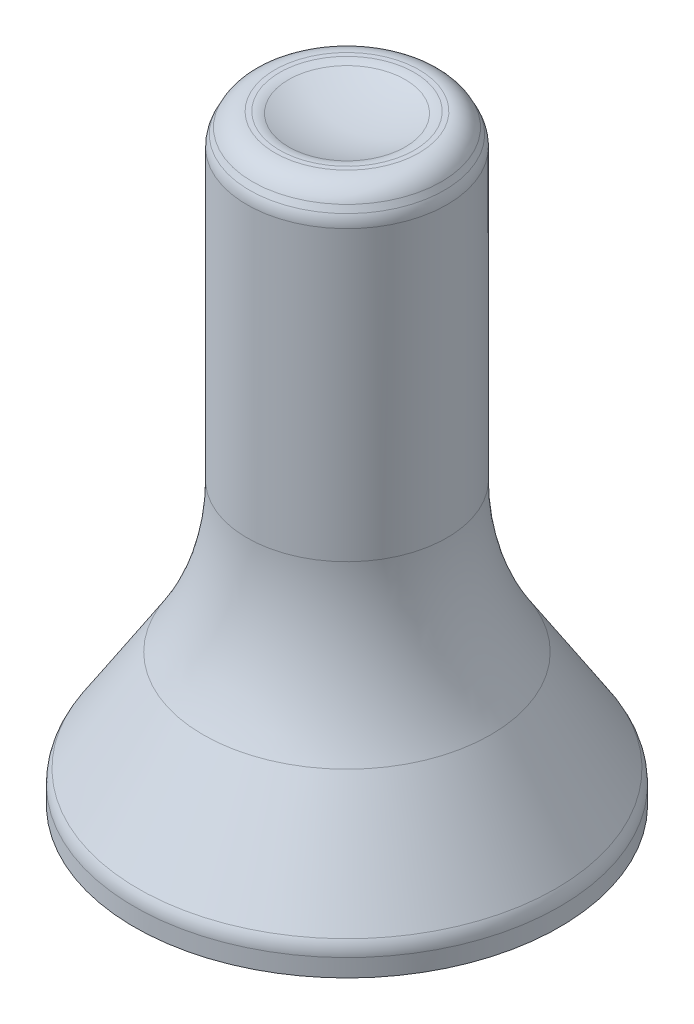
ISO-10303-21;
HEADER;
FILE_DESCRIPTION(('STEP AP214'),'2;1');
FILE_NAME('part.step','',(''),(''),'','','');
FILE_SCHEMA(('AUTOMOTIVE_DESIGN { 1 0 10303 214 1 1 1 1 }'));
ENDSEC;
DATA;
#1=APPLICATION_CONTEXT('core data for automotive mechanical design processes');
#2=APPLICATION_PROTOCOL_DEFINITION('international standard','automotive_design',2000,#1);
#3=PRODUCT_CONTEXT('',#1,'mechanical');
#4=PRODUCT('Part','Part','',(#3));
#5=PRODUCT_RELATED_PRODUCT_CATEGORY('part','',(#4));
#6=PRODUCT_DEFINITION_FORMATION('','',#4);
#7=PRODUCT_DEFINITION_CONTEXT('part definition',#1,'design');
#8=PRODUCT_DEFINITION('design','',#6,#7);
#9=PRODUCT_DEFINITION_SHAPE('','',#8);
#10=(LENGTH_UNIT() NAMED_UNIT(*) SI_UNIT(.MILLI.,.METRE.));
#11=(NAMED_UNIT(*) PLANE_ANGLE_UNIT() SI_UNIT($,.RADIAN.));
#12=(NAMED_UNIT(*) SI_UNIT($,.STERADIAN.) SOLID_ANGLE_UNIT());
#13=UNCERTAINTY_MEASURE_WITH_UNIT(LENGTH_MEASURE(1.E-05),#10,'distance_accuracy_value','');
#14=(GEOMETRIC_REPRESENTATION_CONTEXT(3) GLOBAL_UNCERTAINTY_ASSIGNED_CONTEXT((#13)) GLOBAL_UNIT_ASSIGNED_CONTEXT((#10,
#11,#12)) REPRESENTATION_CONTEXT('',''));
#15=CARTESIAN_POINT('',(0.,0.,0.));
#16=DIRECTION('',(0.,0.,1.));
#17=DIRECTION('',(1.,0.,0.));
#18=AXIS2_PLACEMENT_3D('',#15,#16,#17);
#19=CARTESIAN_POINT('',(0.,17.75,0.));
#20=DIRECTION('',(0.,1.,0.));
#21=DIRECTION('',(-1.,0.,0.));
#22=AXIS2_PLACEMENT_3D('',#19,#20,#21);
#23=CYLINDRICAL_SURFACE('',#22,3.05);
#24=CARTESIAN_POINT('',(0.,7.325,0.));
#25=DIRECTION('',(0.,1.,0.));
#26=DIRECTION('',(-1.,0.,0.));
#27=AXIS2_PLACEMENT_3D('',#24,#25,#26);
#28=CIRCLE('',#27,3.05);
#29=CARTESIAN_POINT('',(2.42487113059643,7.325,1.85));
#30=VERTEX_POINT('',#29);
#31=CARTESIAN_POINT('',(0.0999865618490292,7.325,-3.04836065573771));
#32=VERTEX_POINT('',#31);
#33=EDGE_CURVE('E105',#30,#32,#28,.T.);
#34=ORIENTED_EDGE('',*,*,#33,.F.);
#35=CARTESIAN_POINT('',(0.,9.175,0.));
#36=DIRECTION('',(0.,0.707106781186547,0.707106781186547));
#37=DIRECTION('',(0.,0.707106781186548,-0.707106781186548));
#38=AXIS2_PLACEMENT_3D('',#35,#36,#37);
#39=ELLIPSE('',#38,4.31335136523794,3.05);
#40=CARTESIAN_POINT('',(2.6556543449779,7.675,1.5));
#41=VERTEX_POINT('',#40);
#42=EDGE_CURVE('E11',#30,#41,#39,.T.);
#43=ORIENTED_EDGE('',*,*,#42,.T.);
#44=DIRECTION('',(0.,1.,0.));
#45=VECTOR('',#44,1.);
#46=CARTESIAN_POINT('',(2.6556543449779,1.79214359485084,1.5));
#47=LINE('',#46,#45);
#48=CARTESIAN_POINT('',(2.6556543449779,17.75,1.5));
#49=VERTEX_POINT('',#48);
#50=EDGE_CURVE('E79',#41,#49,#47,.T.);
#51=ORIENTED_EDGE('',*,*,#50,.T.);
#52=CARTESIAN_POINT('',(0.,17.75,0.));
#53=DIRECTION('',(0.,1.,0.));
#54=DIRECTION('',(-1.,0.,0.));
#55=AXIS2_PLACEMENT_3D('',#52,#53,#54);
#56=CIRCLE('',#55,3.05);
#57=CARTESIAN_POINT('',(0.0999865618490328,17.75,-3.04836065573771));
#58=VERTEX_POINT('',#57);
#59=EDGE_CURVE('E83',#49,#58,#56,.T.);
#60=ORIENTED_EDGE('',*,*,#59,.T.);
#61=DIRECTION('',(0.,1.,0.));
#62=VECTOR('',#61,1.);
#63=CARTESIAN_POINT('',(0.0999865618490293,1.79214359485084,-3.04836065573771));
#64=LINE('',#63,#62);
#65=EDGE_CURVE('E255',#32,#58,#64,.T.);
#66=ORIENTED_EDGE('',*,*,#65,.F.);
#67=EDGE_LOOP('',(#34,#43,#51,#60,#66));
#68=FACE_BOUND('',#67,.T.);
#69=ADVANCED_FACE('F33',(#68),#23,.F.);
#70=CARTESIAN_POINT('',(-0.0999865618490304,17.75,-3.04836065573771));
#71=VERTEX_POINT('',#70);
#72=CARTESIAN_POINT('',(-2.6556543449779,17.75,1.5));
#73=VERTEX_POINT('',#72);
#74=EDGE_CURVE('E102',#71,#73,#56,.T.);
#75=ORIENTED_EDGE('',*,*,#74,.T.);
#76=DIRECTION('',(0.,1.,0.));
#77=VECTOR('',#76,1.);
#78=CARTESIAN_POINT('',(-2.6556543449779,1.79214359485084,1.5));
#79=LINE('',#78,#77);
#80=CARTESIAN_POINT('',(-2.6556543449779,7.675,1.5));
#81=VERTEX_POINT('',#80);
#82=EDGE_CURVE('E89',#81,#73,#79,.T.);
#83=ORIENTED_EDGE('',*,*,#82,.F.);
#84=CARTESIAN_POINT('',(0.,9.175,0.));
#85=DIRECTION('',(0.,0.707106781186547,0.707106781186547));
#86=DIRECTION('',(0.,0.707106781186548,-0.707106781186548));
#87=AXIS2_PLACEMENT_3D('',#84,#85,#86);
#88=ELLIPSE('',#87,4.31335136523794,3.05);
#89=CARTESIAN_POINT('',(-2.42487113059643,7.325,1.85));
#90=VERTEX_POINT('',#89);
#91=EDGE_CURVE('E42',#81,#90,#88,.T.);
#92=ORIENTED_EDGE('',*,*,#91,.T.);
#93=CARTESIAN_POINT('',(-0.0999865618490304,7.325,-3.04836065573771));
#94=VERTEX_POINT('',#93);
#95=EDGE_CURVE('E48',#94,#90,#28,.T.);
#96=ORIENTED_EDGE('',*,*,#95,.F.);
#97=DIRECTION('',(0.,1.,0.));
#98=VECTOR('',#97,1.);
#99=CARTESIAN_POINT('',(-0.0999865618490304,1.79214359485084,-3.04836065573771));
#100=LINE('',#99,#98);
#101=EDGE_CURVE('E107',#94,#71,#100,.T.);
#102=ORIENTED_EDGE('',*,*,#101,.T.);
#103=EDGE_LOOP('',(#75,#83,#92,#96,#102));
#104=FACE_BOUND('',#103,.T.);
#105=ADVANCED_FACE('F187',(#104),#23,.F.);
#106=CARTESIAN_POINT('',(3.05,17.75,0.));
#107=DIRECTION('',(0.,-1.,0.));
#108=DIRECTION('',(1.,0.,0.));
#109=AXIS2_PLACEMENT_3D('',#106,#107,#108);
#110=PLANE('',#109);
#111=ORIENTED_EDGE('',*,*,#59,.F.);
#112=DIRECTION('',(1.,0.,0.));
#113=VECTOR('',#112,1.);
#114=CARTESIAN_POINT('',(-2.6556543449779,17.75,1.5));
#115=LINE('',#114,#113);
#116=EDGE_CURVE('E90',#73,#49,#115,.T.);
#117=ORIENTED_EDGE('',*,*,#116,.F.);
#118=ORIENTED_EDGE('',*,*,#74,.F.);
#119=CARTESIAN_POINT('',(0.,17.75,-3.05));
#120=DIRECTION('',(0.,-1.,0.));
#121=DIRECTION('',(1.,0.,0.));
#122=AXIS2_PLACEMENT_3D('',#119,#120,#121);
#123=CIRCLE('',#122,0.0999999999999998);
#124=EDGE_CURVE('E101',#58,#71,#123,.T.);
#125=ORIENTED_EDGE('',*,*,#124,.F.);
#126=EDGE_LOOP('',(#111,#117,#118,#125));
#127=FACE_BOUND('',#126,.T.);
#128=ADVANCED_FACE('F100',(#127),#110,.T.);
#129=CARTESIAN_POINT('',(0.,0.,0.));
#130=DIRECTION('',(0.,1.,0.));
#131=DIRECTION('',(-1.,0.,0.));
#132=AXIS2_PLACEMENT_3D('',#129,#130,#131);
#133=PLANE('',#132);
#134=CARTESIAN_POINT('',(0.,0.,0.));
#135=DIRECTION('',(0.,1.,0.));
#136=DIRECTION('',(-1.,0.,0.));
#137=AXIS2_PLACEMENT_3D('',#134,#135,#136);
#138=CIRCLE('',#137,3.875);
#139=CARTESIAN_POINT('',(-3.875,0.,0.));
#140=VERTEX_POINT('',#139);
#141=EDGE_CURVE('E117',#140,#140,#138,.T.);
#142=ORIENTED_EDGE('',*,*,#141,.T.);
#143=EDGE_LOOP('',(#142));
#144=FACE_BOUND('',#143,.T.);
#145=CARTESIAN_POINT('',(0.,0.,0.));
#146=DIRECTION('',(0.,1.,0.));
#147=DIRECTION('',(-1.,0.,0.));
#148=AXIS2_PLACEMENT_3D('',#145,#146,#147);
#149=CIRCLE('',#148,8.5);
#150=CARTESIAN_POINT('',(-8.5,0.,0.));
#151=VERTEX_POINT('',#150);
#152=EDGE_CURVE('E120',#151,#151,#149,.T.);
#153=ORIENTED_EDGE('',*,*,#152,.F.);
#154=EDGE_LOOP('',(#153));
#155=FACE_BOUND('',#154,.T.);
#156=ADVANCED_FACE('F157',(#144,#155),#133,.F.);
#157=CARTESIAN_POINT('',(0.,23.5,0.));
#158=DIRECTION('',(0.,1.,0.));
#159=DIRECTION('',(-1.,0.,0.));
#160=AXIS2_PLACEMENT_3D('',#157,#158,#159);
#161=CYLINDRICAL_SURFACE('',#160,8.5);
#162=CARTESIAN_POINT('',(0.,0.706298113656308,0.));
#163=DIRECTION('',(0.,-1.,0.));
#164=DIRECTION('',(1.,0.,0.));
#165=AXIS2_PLACEMENT_3D('',#162,#163,#164);
#166=CIRCLE('',#165,8.5);
#167=CARTESIAN_POINT('',(8.5,0.706298113656308,0.));
#168=VERTEX_POINT('',#167);
#169=EDGE_CURVE('E222',#168,#168,#166,.T.);
#170=ORIENTED_EDGE('',*,*,#169,.T.);
#171=EDGE_LOOP('',(#170));
#172=FACE_BOUND('',#171,.T.);
#173=ORIENTED_EDGE('',*,*,#152,.T.);
#174=EDGE_LOOP('',(#173));
#175=FACE_BOUND('',#174,.T.);
#176=ADVANCED_FACE('F153',(#172,#175),#161,.T.);
#177=CARTESIAN_POINT('',(0.,1.,0.));
#178=DIRECTION('',(0.,-1.,0.));
#179=DIRECTION('',(1.,0.,0.));
#180=AXIS2_PLACEMENT_3D('',#177,#178,#179);
#181=CONICAL_SURFACE('',#180,8.5,0.571337479833627);
#182=CARTESIAN_POINT('',(0.,1.24705570496981,0.));
#183=DIRECTION('',(0.,1.,0.));
#184=DIRECTION('',(-1.,0.,0.));
#185=AXIS2_PLACEMENT_3D('',#182,#183,#184);
#186=CIRCLE('',#185,8.34117847537655);
#187=CARTESIAN_POINT('',(-8.34117847537655,1.24705570496981,0.));
#188=VERTEX_POINT('',#187);
#189=EDGE_CURVE('E217',#188,#188,#186,.T.);
#190=ORIENTED_EDGE('',*,*,#189,.T.);
#191=EDGE_LOOP('',(#190));
#192=FACE_BOUND('',#191,.T.);
#193=CARTESIAN_POINT('',(0.,5.28238724533214,0.));
#194=DIRECTION('',(0.,-1.,0.));
#195=DIRECTION('',(1.,0.,0.));
#196=AXIS2_PLACEMENT_3D('',#193,#194,#195);
#197=CIRCLE('',#196,5.74703677085791);
#198=CARTESIAN_POINT('',(5.74703677085791,5.28238724533214,0.));
#199=VERTEX_POINT('',#198);
#200=EDGE_CURVE('E213',#199,#199,#197,.T.);
#201=ORIENTED_EDGE('',*,*,#200,.T.);
#202=EDGE_LOOP('',(#201));
#203=FACE_BOUND('',#202,.T.);
#204=ADVANCED_FACE('F149',(#192,#203),#181,.T.);
#205=CARTESIAN_POINT('',(0.,23.5,0.));
#206=DIRECTION('',(0.,1.,0.));
#207=DIRECTION('',(-1.,0.,0.));
#208=AXIS2_PLACEMENT_3D('',#205,#206,#207);
#209=CYLINDRICAL_SURFACE('',#208,4.);
#210=CARTESIAN_POINT('',(0.,22.7639320225002,0.));
#211=DIRECTION('',(0.,-1.,0.));
#212=DIRECTION('',(1.,0.,0.));
#213=AXIS2_PLACEMENT_3D('',#210,#211,#212);
#214=CIRCLE('',#213,4.);
#215=CARTESIAN_POINT('',(4.,22.7639320225002,0.));
#216=VERTEX_POINT('',#215);
#217=EDGE_CURVE('E240',#216,#216,#214,.T.);
#218=ORIENTED_EDGE('',*,*,#217,.T.);
#219=EDGE_LOOP('',(#218));
#220=FACE_BOUND('',#219,.T.);
#221=CARTESIAN_POINT('',(0.,11.2307207497806,0.));
#222=DIRECTION('',(0.,1.,0.));
#223=DIRECTION('',(-1.,0.,0.));
#224=AXIS2_PLACEMENT_3D('',#221,#222,#223);
#225=CIRCLE('',#224,4.);
#226=CARTESIAN_POINT('',(-4.,11.2307207497806,0.));
#227=VERTEX_POINT('',#226);
#228=EDGE_CURVE('E211',#227,#227,#225,.T.);
#229=ORIENTED_EDGE('',*,*,#228,.T.);
#230=EDGE_LOOP('',(#229));
#231=FACE_BOUND('',#230,.T.);
#232=ADVANCED_FACE('F145',(#220,#231),#209,.T.);
#233=CARTESIAN_POINT('',(0.,23.,0.));
#234=DIRECTION('',(0.,-1.,0.));
#235=DIRECTION('',(1.,0.,0.));
#236=AXIS2_PLACEMENT_3D('',#233,#234,#235);
#237=CONICAL_SURFACE('',#236,4.,0.463647609000806);
#238=CARTESIAN_POINT('',(0.,23.4472135955,0.));
#239=DIRECTION('',(0.,1.,0.));
#240=DIRECTION('',(-1.,0.,0.));
#241=AXIS2_PLACEMENT_3D('',#238,#239,#240);
#242=CIRCLE('',#241,3.77639320225002);
#243=CARTESIAN_POINT('',(-3.77639320225002,23.4472135955,0.));
#244=VERTEX_POINT('',#243);
#245=EDGE_CURVE('E237',#244,#244,#242,.F.);
#246=ORIENTED_EDGE('',*,*,#245,.T.);
#247=EDGE_LOOP('',(#246));
#248=FACE_BOUND('',#247,.T.);
#249=CARTESIAN_POINT('',(0.,23.2111456180002,0.));
#250=DIRECTION('',(0.,1.,0.));
#251=DIRECTION('',(-1.,0.,0.));
#252=AXIS2_PLACEMENT_3D('',#249,#250,#251);
#253=CIRCLE('',#252,3.89442719099991);
#254=CARTESIAN_POINT('',(-3.89442719099991,23.2111456180002,0.));
#255=VERTEX_POINT('',#254);
#256=EDGE_CURVE('E234',#255,#255,#253,.T.);
#257=ORIENTED_EDGE('',*,*,#256,.T.);
#258=EDGE_LOOP('',(#257));
#259=FACE_BOUND('',#258,.T.);
#260=ADVANCED_FACE('F141',(#248,#259),#237,.T.);
#261=CARTESIAN_POINT('',(3.5,24.,0.));
#262=DIRECTION('',(0.,-1.,0.));
#263=DIRECTION('',(1.,0.,0.));
#264=AXIS2_PLACEMENT_3D('',#261,#262,#263);
#265=PLANE('',#264);
#266=CARTESIAN_POINT('',(0.,24.,0.));
#267=DIRECTION('',(0.,-1.,0.));
#268=DIRECTION('',(1.,0.,0.));
#269=AXIS2_PLACEMENT_3D('',#266,#267,#268);
#270=CIRCLE('',#269,2.69281355125541);
#271=CARTESIAN_POINT('',(2.69281355125541,24.,0.));
#272=VERTEX_POINT('',#271);
#273=EDGE_CURVE('E231',#272,#272,#270,.T.);
#274=ORIENTED_EDGE('',*,*,#273,.T.);
#275=EDGE_LOOP('',(#274));
#276=FACE_BOUND('',#275,.T.);
#277=CARTESIAN_POINT('',(0.,24.,0.));
#278=DIRECTION('',(0.,-1.,0.));
#279=DIRECTION('',(1.,0.,0.));
#280=AXIS2_PLACEMENT_3D('',#277,#278,#279);
#281=CIRCLE('',#280,2.88196601125011);
#282=CARTESIAN_POINT('',(2.88196601125011,24.,0.));
#283=VERTEX_POINT('',#282);
#284=EDGE_CURVE('E228',#283,#283,#281,.F.);
#285=ORIENTED_EDGE('',*,*,#284,.T.);
#286=EDGE_LOOP('',(#285));
#287=FACE_BOUND('',#286,.T.);
#288=ADVANCED_FACE('F135',(#276,#287),#265,.F.);
#289=CARTESIAN_POINT('',(2.5,24.,0.));
#290=CARTESIAN_POINT('',(1.3,23.5,0.));
#291=CARTESIAN_POINT('',(0.,23.5,0.));
#292=B_SPLINE_CURVE_WITH_KNOTS('',2,(#289,#290,#291),.UNSPECIFIED.,.F.,.F.,(3,3),(0.,1.),.UNSPECIFIED.);
#293=CARTESIAN_POINT('',(0.,23.5,0.));
#294=DIRECTION('',(0.,1.,0.));
#295=AXIS1_PLACEMENT('',#293,#294);
#296=SURFACE_OF_REVOLUTION('',#292,#295);
#297=CARTESIAN_POINT('',(0.,23.9330553078539,0.));
#298=DIRECTION('',(0.,1.,0.));
#299=DIRECTION('',(-1.,0.,0.));
#300=AXIS2_PLACEMENT_3D('',#297,#298,#299);
#301=CIRCLE('',#300,2.33308060518872);
#302=CARTESIAN_POINT('',(-2.33308060518872,23.9330553078539,0.));
#303=VERTEX_POINT('',#302);
#304=EDGE_CURVE('E225',#303,#303,#301,.T.);
#305=ORIENTED_EDGE('',*,*,#304,.T.);
#306=EDGE_LOOP('',(#305));
#307=FACE_BOUND('',#306,.T.);
#308=CARTESIAN_POINT('',(0.,23.5,0.));
#309=VERTEX_POINT('',#308);
#310=VERTEX_LOOP('',#309);
#311=FACE_BOUND('',#310,.T.);
#312=ADVANCED_FACE('F130',(#307,#311),#296,.T.);
#313=CARTESIAN_POINT('',(0.,11.2307207497806,0.));
#314=DIRECTION('',(0.,1.,0.));
#315=DIRECTION('',(-1.,0.,0.));
#316=AXIS2_PLACEMENT_3D('',#313,#314,#315);
#317=TOROIDAL_SURFACE('',#316,15.,11.);
#318=ORIENTED_EDGE('',*,*,#200,.F.);
#319=EDGE_LOOP('',(#318));
#320=FACE_BOUND('',#319,.T.);
#321=ORIENTED_EDGE('',*,*,#228,.F.);
#322=EDGE_LOOP('',(#321));
#323=FACE_BOUND('',#322,.T.);
#324=ADVANCED_FACE('F134',(#320,#323),#317,.F.);
#325=CARTESIAN_POINT('',(0.,0.706298113656308,0.));
#326=DIRECTION('',(0.,-1.,0.));
#327=DIRECTION('',(1.,0.,0.));
#328=AXIS2_PLACEMENT_3D('',#325,#326,#327);
#329=TOROIDAL_SURFACE('',#328,7.5,1.);
#330=ORIENTED_EDGE('',*,*,#169,.F.);
#331=EDGE_LOOP('',(#330));
#332=FACE_BOUND('',#331,.T.);
#333=ORIENTED_EDGE('',*,*,#189,.F.);
#334=EDGE_LOOP('',(#333));
#335=FACE_BOUND('',#334,.T.);
#336=ADVANCED_FACE('F164',(#332,#335),#329,.T.);
#337=CARTESIAN_POINT('',(0.,23.0000000000001,0.));
#338=DIRECTION('',(0.,1.,0.));
#339=DIRECTION('',(-1.,0.,0.));
#340=AXIS2_PLACEMENT_3D('',#337,#338,#339);
#341=TOROIDAL_SURFACE('',#340,2.69281355125541,1.);
#342=ORIENTED_EDGE('',*,*,#273,.F.);
#343=EDGE_LOOP('',(#342));
#344=FACE_BOUND('',#343,.T.);
#345=ORIENTED_EDGE('',*,*,#304,.F.);
#346=EDGE_LOOP('',(#345));
#347=FACE_BOUND('',#346,.T.);
#348=ADVANCED_FACE('F168',(#344,#347),#341,.T.);
#349=CARTESIAN_POINT('',(0.,23.,0.));
#350=DIRECTION('',(0.,-1.,0.));
#351=DIRECTION('',(1.,0.,0.));
#352=AXIS2_PLACEMENT_3D('',#349,#350,#351);
#353=TOROIDAL_SURFACE('',#352,2.88196601125011,1.);
#354=ORIENTED_EDGE('',*,*,#245,.F.);
#355=EDGE_LOOP('',(#354));
#356=FACE_BOUND('',#355,.T.);
#357=ORIENTED_EDGE('',*,*,#284,.F.);
#358=EDGE_LOOP('',(#357));
#359=FACE_BOUND('',#358,.T.);
#360=ADVANCED_FACE('F172',(#356,#359),#353,.T.);
#361=CARTESIAN_POINT('',(0.,22.7639320225002,0.));
#362=DIRECTION('',(0.,-1.,0.));
#363=DIRECTION('',(1.,0.,0.));
#364=AXIS2_PLACEMENT_3D('',#361,#362,#363);
#365=TOROIDAL_SURFACE('',#364,3.,1.);
#366=ORIENTED_EDGE('',*,*,#217,.F.);
#367=EDGE_LOOP('',(#366));
#368=FACE_BOUND('',#367,.T.);
#369=ORIENTED_EDGE('',*,*,#256,.F.);
#370=EDGE_LOOP('',(#369));
#371=FACE_BOUND('',#370,.T.);
#372=ADVANCED_FACE('F175',(#368,#371),#365,.T.);
#373=CARTESIAN_POINT('',(0.,17.75,0.));
#374=DIRECTION('',(0.,1.,0.));
#375=DIRECTION('',(-1.,0.,0.));
#376=AXIS2_PLACEMENT_3D('',#373,#374,#375);
#377=CYLINDRICAL_SURFACE('',#376,3.875);
#378=CARTESIAN_POINT('',(0.,6.5,0.));
#379=DIRECTION('',(0.,1.,0.));
#380=DIRECTION('',(-1.,0.,0.));
#381=AXIS2_PLACEMENT_3D('',#378,#379,#380);
#382=CIRCLE('',#381,3.875);
#383=CARTESIAN_POINT('',(-3.875,6.5,0.));
#384=VERTEX_POINT('',#383);
#385=EDGE_CURVE('E114',#384,#384,#382,.T.);
#386=ORIENTED_EDGE('',*,*,#385,.T.);
#387=EDGE_LOOP('',(#386));
#388=FACE_BOUND('',#387,.T.);
#389=ORIENTED_EDGE('',*,*,#141,.F.);
#390=EDGE_LOOP('',(#389));
#391=FACE_BOUND('',#390,.T.);
#392=ADVANCED_FACE('F137',(#388,#391),#377,.F.);
#393=CARTESIAN_POINT('',(0.,6.5,0.));
#394=DIRECTION('',(0.,-1.,0.));
#395=DIRECTION('',(1.,0.,0.));
#396=AXIS2_PLACEMENT_3D('',#393,#394,#395);
#397=CONICAL_SURFACE('',#396,3.875,0.785398163397448);
#398=EDGE_CURVE('E112',#32,#94,#28,.T.);
#399=ORIENTED_EDGE('',*,*,#398,.T.);
#400=ORIENTED_EDGE('',*,*,#95,.T.);
#401=CARTESIAN_POINT('',(0.,7.325,0.));
#402=DIRECTION('',(0.,1.,0.));
#403=DIRECTION('',(0.,0.,1.));
#404=AXIS2_PLACEMENT_3D('',#401,#402,#403);
#405=CIRCLE('',#404,3.05);
#406=EDGE_CURVE('E253',#90,#30,#405,.T.);
#407=ORIENTED_EDGE('',*,*,#406,.T.);
#408=ORIENTED_EDGE('',*,*,#33,.T.);
#409=EDGE_LOOP('',(#399,#400,#407,#408));
#410=FACE_BOUND('',#409,.T.);
#411=ORIENTED_EDGE('',*,*,#385,.F.);
#412=EDGE_LOOP('',(#411));
#413=FACE_BOUND('',#412,.T.);
#414=ADVANCED_FACE('F182',(#410,#413),#397,.F.);
#415=CARTESIAN_POINT('',(0.,1.79214359485084,-3.05));
#416=DIRECTION('',(0.,1.,0.));
#417=DIRECTION('',(-1.,0.,0.));
#418=AXIS2_PLACEMENT_3D('',#415,#416,#417);
#419=CYLINDRICAL_SURFACE('',#418,0.0999999999999998);
#420=ORIENTED_EDGE('',*,*,#101,.F.);
#421=CARTESIAN_POINT('',(0.,7.325,-3.05));
#422=DIRECTION('',(0.,1.,0.));
#423=DIRECTION('',(0.,0.,1.));
#424=AXIS2_PLACEMENT_3D('',#421,#422,#423);
#425=CIRCLE('',#424,0.0999999999999998);
#426=EDGE_CURVE('E103',#94,#32,#425,.T.);
#427=ORIENTED_EDGE('',*,*,#426,.T.);
#428=ORIENTED_EDGE('',*,*,#65,.T.);
#429=ORIENTED_EDGE('',*,*,#124,.T.);
#430=EDGE_LOOP('',(#420,#427,#428,#429));
#431=FACE_BOUND('',#430,.T.);
#432=ADVANCED_FACE('F196',(#431),#419,.T.);
#433=CARTESIAN_POINT('',(0.,7.325,0.));
#434=DIRECTION('',(0.,1.,0.));
#435=DIRECTION('',(0.,0.,1.));
#436=AXIS2_PLACEMENT_3D('',#433,#434,#435);
#437=PLANE('',#436);
#438=ORIENTED_EDGE('',*,*,#398,.F.);
#439=ORIENTED_EDGE('',*,*,#426,.F.);
#440=EDGE_LOOP('',(#438,#439));
#441=FACE_BOUND('',#440,.T.);
#442=ADVANCED_FACE('F200',(#441),#437,.F.);
#443=CARTESIAN_POINT('',(-2.6556543449779,1.79214359485084,1.5));
#444=DIRECTION('',(0.,0.,1.));
#445=DIRECTION('',(1.,0.,0.));
#446=AXIS2_PLACEMENT_3D('',#443,#444,#445);
#447=PLANE('',#446);
#448=ORIENTED_EDGE('',*,*,#50,.F.);
#449=DIRECTION('',(-1.,0.,0.));
#450=VECTOR('',#449,1.);
#451=CARTESIAN_POINT('',(-2.6556543449779,7.675,1.5));
#452=LINE('',#451,#450);
#453=EDGE_CURVE('E243',#41,#81,#452,.T.);
#454=ORIENTED_EDGE('',*,*,#453,.T.);
#455=ORIENTED_EDGE('',*,*,#82,.T.);
#456=ORIENTED_EDGE('',*,*,#116,.T.);
#457=EDGE_LOOP('',(#448,#454,#455,#456));
#458=FACE_BOUND('',#457,.T.);
#459=ADVANCED_FACE('F93',(#458),#447,.F.);
#460=CARTESIAN_POINT('',(0.,7.325,0.));
#461=DIRECTION('',(0.,1.,0.));
#462=DIRECTION('',(0.,0.,1.));
#463=AXIS2_PLACEMENT_3D('',#460,#461,#462);
#464=PLANE('',#463);
#465=ORIENTED_EDGE('',*,*,#406,.F.);
#466=DIRECTION('',(1.,0.,0.));
#467=VECTOR('',#466,1.);
#468=CARTESIAN_POINT('',(0.,7.325,1.85));
#469=LINE('',#468,#467);
#470=EDGE_CURVE('E245',#90,#30,#469,.T.);
#471=ORIENTED_EDGE('',*,*,#470,.T.);
#472=EDGE_LOOP('',(#465,#471));
#473=FACE_BOUND('',#472,.T.);
#474=ADVANCED_FACE('F252',(#473),#464,.F.);
#475=CARTESIAN_POINT('',(-2.6556543449779,7.675,1.5));
#476=DIRECTION('',(0.,0.707106781186547,0.707106781186547));
#477=DIRECTION('',(-1.,0.,0.));
#478=AXIS2_PLACEMENT_3D('',#475,#476,#477);
#479=PLANE('',#478);
#480=ORIENTED_EDGE('',*,*,#42,.F.);
#481=ORIENTED_EDGE('',*,*,#470,.F.);
#482=ORIENTED_EDGE('',*,*,#91,.F.);
#483=ORIENTED_EDGE('',*,*,#453,.F.);
#484=EDGE_LOOP('',(#480,#481,#482,#483));
#485=FACE_BOUND('',#484,.T.);
#486=ADVANCED_FACE('F35',(#485),#479,.F.);
#487=CLOSED_SHELL('',(#69,#105,#128,#156,#176,#204,#232,#260,#288,#312,#324,#336,#348,#360,#372,
#392,#414,#432,#442,#459,#474,#486));
#488=MANIFOLD_SOLID_BREP('B2',#487);
#489=ADVANCED_BREP_SHAPE_REPRESENTATION('',(#18,#488),#14);
#490=SHAPE_DEFINITION_REPRESENTATION(#9,#489);
ENDSEC;
END-ISO-10303-21;
